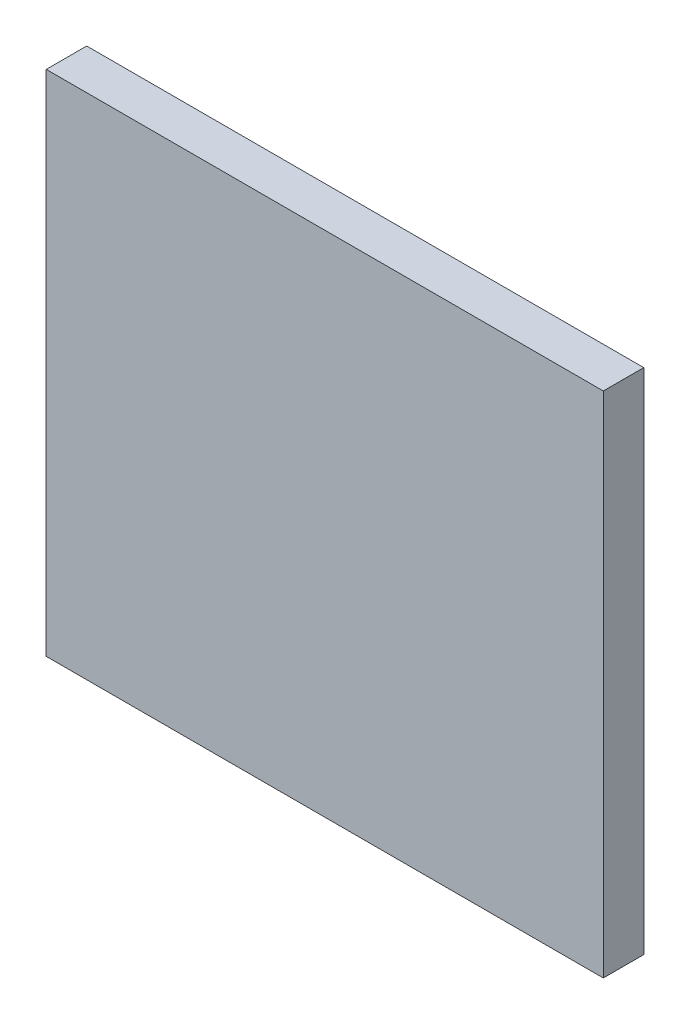
ISO-10303-21;
HEADER;
FILE_DESCRIPTION(('STEP AP214'),'2;1');
FILE_NAME('part.step','',(''),(''),'','','');
FILE_SCHEMA(('AUTOMOTIVE_DESIGN { 1 0 10303 214 1 1 1 1 }'));
ENDSEC;
DATA;
#1=APPLICATION_CONTEXT('core data for automotive mechanical design processes');
#2=APPLICATION_PROTOCOL_DEFINITION('international standard','automotive_design',2000,#1);
#3=PRODUCT_CONTEXT('',#1,'mechanical');
#4=PRODUCT('Part','Part','',(#3));
#5=PRODUCT_RELATED_PRODUCT_CATEGORY('part','',(#4));
#6=PRODUCT_DEFINITION_FORMATION('','',#4);
#7=PRODUCT_DEFINITION_CONTEXT('part definition',#1,'design');
#8=PRODUCT_DEFINITION('design','',#6,#7);
#9=PRODUCT_DEFINITION_SHAPE('','',#8);
#10=(LENGTH_UNIT() NAMED_UNIT(*) SI_UNIT(.MILLI.,.METRE.));
#11=(NAMED_UNIT(*) PLANE_ANGLE_UNIT() SI_UNIT($,.RADIAN.));
#12=(NAMED_UNIT(*) SI_UNIT($,.STERADIAN.) SOLID_ANGLE_UNIT());
#13=UNCERTAINTY_MEASURE_WITH_UNIT(LENGTH_MEASURE(1.E-05),#10,'distance_accuracy_value','');
#14=(GEOMETRIC_REPRESENTATION_CONTEXT(3) GLOBAL_UNCERTAINTY_ASSIGNED_CONTEXT((#13)) GLOBAL_UNIT_ASSIGNED_CONTEXT((#10,
#11,#12)) REPRESENTATION_CONTEXT('',''));
#15=CARTESIAN_POINT('',(0.,0.,0.));
#16=DIRECTION('',(0.,0.,1.));
#17=DIRECTION('',(1.,0.,0.));
#18=AXIS2_PLACEMENT_3D('',#15,#16,#17);
#19=CARTESIAN_POINT('',(-17.6427729836807,15.8383984739861,3.));
#20=DIRECTION('',(1.,0.,0.));
#21=DIRECTION('',(0.,0.,-1.));
#22=AXIS2_PLACEMENT_3D('',#19,#20,#21);
#23=PLANE('',#22);
#24=DIRECTION('',(0.,-1.,0.));
#25=VECTOR('',#24,1.);
#26=CARTESIAN_POINT('',(-17.6427729836807,15.8383984739861,0.));
#27=LINE('',#26,#25);
#28=CARTESIAN_POINT('',(-17.6427729836807,15.8383984739861,0.));
#29=VERTEX_POINT('',#28);
#30=CARTESIAN_POINT('',(-17.6427729836807,-21.8529801729682,0.));
#31=VERTEX_POINT('',#30);
#32=EDGE_CURVE('E96',#29,#31,#27,.T.);
#33=ORIENTED_EDGE('',*,*,#32,.T.);
#34=DIRECTION('',(0.,0.,-1.));
#35=VECTOR('',#34,1.);
#36=CARTESIAN_POINT('',(-17.6427729836807,-21.8529801729682,3.));
#37=LINE('',#36,#35);
#38=CARTESIAN_POINT('',(-17.6427729836807,-21.8529801729682,3.));
#39=VERTEX_POINT('',#38);
#40=EDGE_CURVE('E11',#39,#31,#37,.T.);
#41=ORIENTED_EDGE('',*,*,#40,.F.);
#42=DIRECTION('',(0.,-1.,0.));
#43=VECTOR('',#42,1.);
#44=CARTESIAN_POINT('',(-17.6427729836807,15.8383984739861,3.));
#45=LINE('',#44,#43);
#46=CARTESIAN_POINT('',(-17.6427729836807,15.8383984739861,3.));
#47=VERTEX_POINT('',#46);
#48=EDGE_CURVE('E84',#47,#39,#45,.T.);
#49=ORIENTED_EDGE('',*,*,#48,.F.);
#50=DIRECTION('',(0.,0.,-1.));
#51=VECTOR('',#50,1.);
#52=CARTESIAN_POINT('',(-17.6427729836807,15.8383984739861,3.));
#53=LINE('',#52,#51);
#54=EDGE_CURVE('E92',#47,#29,#53,.T.);
#55=ORIENTED_EDGE('',*,*,#54,.T.);
#56=EDGE_LOOP('',(#33,#41,#49,#55));
#57=FACE_BOUND('',#56,.T.);
#58=ADVANCED_FACE('F33',(#57),#23,.F.);
#59=CARTESIAN_POINT('',(-17.6427729836807,-21.8529801729682,3.));
#60=DIRECTION('',(0.,1.,0.));
#61=DIRECTION('',(0.,0.,1.));
#62=AXIS2_PLACEMENT_3D('',#59,#60,#61);
#63=PLANE('',#62);
#64=DIRECTION('',(1.,0.,0.));
#65=VECTOR('',#64,1.);
#66=CARTESIAN_POINT('',(-17.6427729836807,-21.8529801729682,0.));
#67=LINE('',#66,#65);
#68=CARTESIAN_POINT('',(23.6573546826628,-21.8529801729682,0.));
#69=VERTEX_POINT('',#68);
#70=EDGE_CURVE('E88',#31,#69,#67,.T.);
#71=ORIENTED_EDGE('',*,*,#70,.T.);
#72=DIRECTION('',(0.,0.,-1.));
#73=VECTOR('',#72,1.);
#74=CARTESIAN_POINT('',(23.6573546826628,-21.8529801729682,3.));
#75=LINE('',#74,#73);
#76=CARTESIAN_POINT('',(23.6573546826628,-21.8529801729682,3.));
#77=VERTEX_POINT('',#76);
#78=EDGE_CURVE('E41',#77,#69,#75,.T.);
#79=ORIENTED_EDGE('',*,*,#78,.F.);
#80=DIRECTION('',(1.,0.,0.));
#81=VECTOR('',#80,1.);
#82=CARTESIAN_POINT('',(-17.6427729836807,-21.8529801729682,3.));
#83=LINE('',#82,#81);
#84=EDGE_CURVE('E79',#39,#77,#83,.T.);
#85=ORIENTED_EDGE('',*,*,#84,.F.);
#86=ORIENTED_EDGE('',*,*,#40,.T.);
#87=EDGE_LOOP('',(#71,#79,#85,#86));
#88=FACE_BOUND('',#87,.T.);
#89=ADVANCED_FACE('F87',(#88),#63,.F.);
#90=CARTESIAN_POINT('',(23.6573546826628,15.8383984739861,3.));
#91=DIRECTION('',(-1.,0.,0.));
#92=DIRECTION('',(0.,0.,1.));
#93=AXIS2_PLACEMENT_3D('',#90,#91,#92);
#94=PLANE('',#93);
#95=DIRECTION('',(0.,1.,0.));
#96=VECTOR('',#95,1.);
#97=CARTESIAN_POINT('',(23.6573546826628,15.8383984739861,0.));
#98=LINE('',#97,#96);
#99=CARTESIAN_POINT('',(23.6573546826628,15.8383984739861,0.));
#100=VERTEX_POINT('',#99);
#101=EDGE_CURVE('E66',#69,#100,#98,.T.);
#102=ORIENTED_EDGE('',*,*,#101,.T.);
#103=DIRECTION('',(0.,0.,-1.));
#104=VECTOR('',#103,1.);
#105=CARTESIAN_POINT('',(23.6573546826628,15.8383984739861,3.));
#106=LINE('',#105,#104);
#107=CARTESIAN_POINT('',(23.6573546826628,15.8383984739861,3.));
#108=VERTEX_POINT('',#107);
#109=EDGE_CURVE('E89',#108,#100,#106,.T.);
#110=ORIENTED_EDGE('',*,*,#109,.F.);
#111=DIRECTION('',(0.,1.,0.));
#112=VECTOR('',#111,1.);
#113=CARTESIAN_POINT('',(23.6573546826628,15.8383984739861,3.));
#114=LINE('',#113,#112);
#115=EDGE_CURVE('E82',#77,#108,#114,.T.);
#116=ORIENTED_EDGE('',*,*,#115,.F.);
#117=ORIENTED_EDGE('',*,*,#78,.T.);
#118=EDGE_LOOP('',(#102,#110,#116,#117));
#119=FACE_BOUND('',#118,.T.);
#120=ADVANCED_FACE('F90',(#119),#94,.F.);
#121=CARTESIAN_POINT('',(-17.6427729836807,15.8383984739861,3.));
#122=DIRECTION('',(0.,-1.,0.));
#123=DIRECTION('',(0.,0.,-1.));
#124=AXIS2_PLACEMENT_3D('',#121,#122,#123);
#125=PLANE('',#124);
#126=DIRECTION('',(-1.,0.,0.));
#127=VECTOR('',#126,1.);
#128=CARTESIAN_POINT('',(-17.6427729836807,15.8383984739861,0.));
#129=LINE('',#128,#127);
#130=EDGE_CURVE('E72',#100,#29,#129,.T.);
#131=ORIENTED_EDGE('',*,*,#130,.T.);
#132=ORIENTED_EDGE('',*,*,#54,.F.);
#133=DIRECTION('',(-1.,0.,0.));
#134=VECTOR('',#133,1.);
#135=CARTESIAN_POINT('',(-17.6427729836807,15.8383984739861,3.));
#136=LINE('',#135,#134);
#137=EDGE_CURVE('E49',#108,#47,#136,.T.);
#138=ORIENTED_EDGE('',*,*,#137,.F.);
#139=ORIENTED_EDGE('',*,*,#109,.T.);
#140=EDGE_LOOP('',(#131,#132,#138,#139));
#141=FACE_BOUND('',#140,.T.);
#142=ADVANCED_FACE('F103',(#141),#125,.F.);
#143=CARTESIAN_POINT('',(0.,0.,3.));
#144=DIRECTION('',(0.,0.,1.));
#145=DIRECTION('',(1.,0.,0.));
#146=AXIS2_PLACEMENT_3D('',#143,#144,#145);
#147=PLANE('',#146);
#148=ORIENTED_EDGE('',*,*,#48,.T.);
#149=ORIENTED_EDGE('',*,*,#84,.T.);
#150=ORIENTED_EDGE('',*,*,#115,.T.);
#151=ORIENTED_EDGE('',*,*,#137,.T.);
#152=EDGE_LOOP('',(#148,#149,#150,#151));
#153=FACE_BOUND('',#152,.T.);
#154=ADVANCED_FACE('F80',(#153),#147,.T.);
#155=CARTESIAN_POINT('',(0.,0.,0.));
#156=DIRECTION('',(0.,0.,1.));
#157=DIRECTION('',(1.,0.,0.));
#158=AXIS2_PLACEMENT_3D('',#155,#156,#157);
#159=PLANE('',#158);
#160=ORIENTED_EDGE('',*,*,#32,.F.);
#161=ORIENTED_EDGE('',*,*,#130,.F.);
#162=ORIENTED_EDGE('',*,*,#101,.F.);
#163=ORIENTED_EDGE('',*,*,#70,.F.);
#164=EDGE_LOOP('',(#160,#161,#162,#163));
#165=FACE_BOUND('',#164,.T.);
#166=ADVANCED_FACE('F106',(#165),#159,.F.);
#167=CLOSED_SHELL('',(#58,#89,#120,#142,#154,#166));
#168=MANIFOLD_SOLID_BREP('B2',#167);
#169=ADVANCED_BREP_SHAPE_REPRESENTATION('',(#18,#168),#14);
#170=SHAPE_DEFINITION_REPRESENTATION(#9,#169);
ENDSEC;
END-ISO-10303-21;
